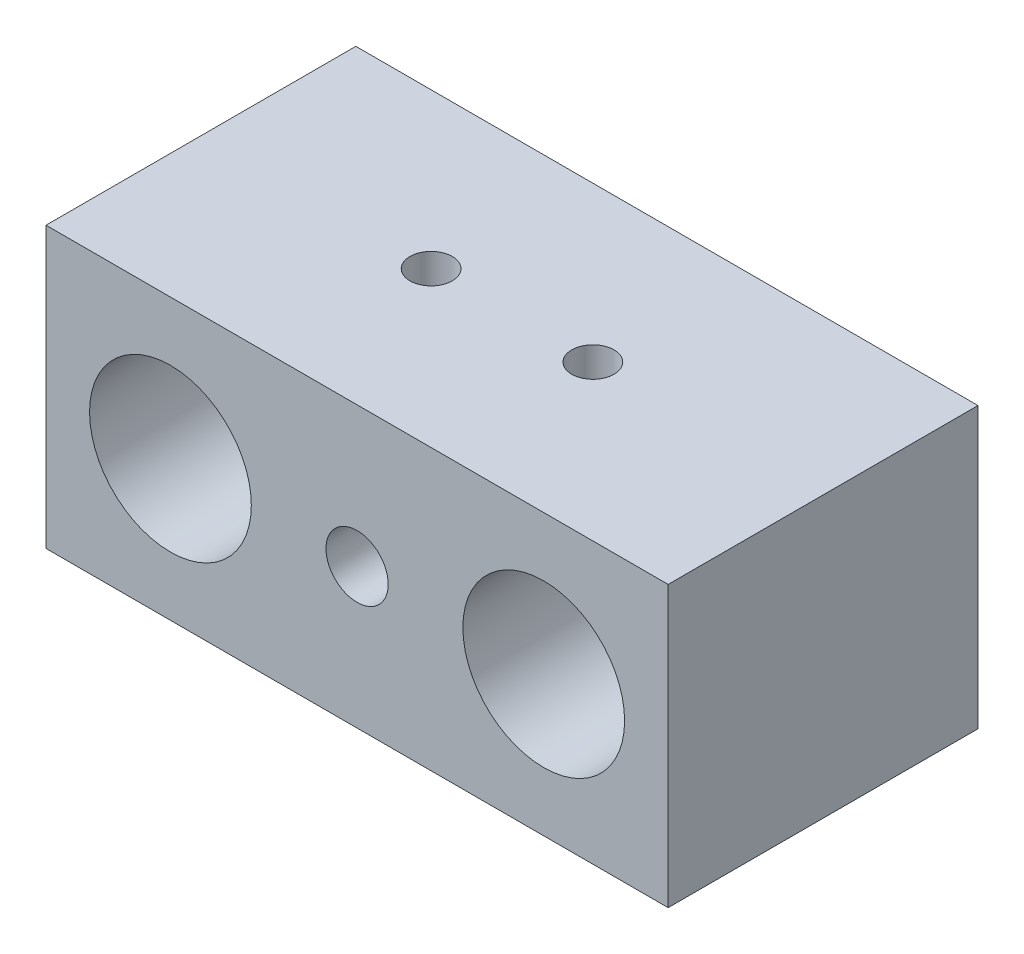
ISO-10303-21;
HEADER;
FILE_DESCRIPTION(('STEP AP214'),'2;1');
FILE_NAME('part.step','',(''),(''),'','','');
FILE_SCHEMA(('AUTOMOTIVE_DESIGN { 1 0 10303 214 1 1 1 1 }'));
ENDSEC;
DATA;
#1=APPLICATION_CONTEXT('core data for automotive mechanical design processes');
#2=APPLICATION_PROTOCOL_DEFINITION('international standard','automotive_design',2000,#1);
#3=PRODUCT_CONTEXT('',#1,'mechanical');
#4=PRODUCT('Part','Part','',(#3));
#5=PRODUCT_RELATED_PRODUCT_CATEGORY('part','',(#4));
#6=PRODUCT_DEFINITION_FORMATION('','',#4);
#7=PRODUCT_DEFINITION_CONTEXT('part definition',#1,'design');
#8=PRODUCT_DEFINITION('design','',#6,#7);
#9=PRODUCT_DEFINITION_SHAPE('','',#8);
#10=(LENGTH_UNIT() NAMED_UNIT(*) SI_UNIT(.MILLI.,.METRE.));
#11=(NAMED_UNIT(*) PLANE_ANGLE_UNIT() SI_UNIT($,.RADIAN.));
#12=(NAMED_UNIT(*) SI_UNIT($,.STERADIAN.) SOLID_ANGLE_UNIT());
#13=UNCERTAINTY_MEASURE_WITH_UNIT(LENGTH_MEASURE(1.E-05),#10,'distance_accuracy_value','');
#14=(GEOMETRIC_REPRESENTATION_CONTEXT(3) GLOBAL_UNCERTAINTY_ASSIGNED_CONTEXT((#13)) GLOBAL_UNIT_ASSIGNED_CONTEXT((#10,
#11,#12)) REPRESENTATION_CONTEXT('',''));
#15=CARTESIAN_POINT('',(0.,0.,0.));
#16=DIRECTION('',(0.,0.,1.));
#17=DIRECTION('',(1.,0.,0.));
#18=AXIS2_PLACEMENT_3D('',#15,#16,#17);
#19=CARTESIAN_POINT('',(0.,0.,-24.9));
#20=DIRECTION('',(0.,0.,1.));
#21=DIRECTION('',(1.,0.,0.));
#22=AXIS2_PLACEMENT_3D('',#19,#20,#21);
#23=CYLINDRICAL_SURFACE('',#22,5.);
#24=CARTESIAN_POINT('',(0.,0.,24.9));
#25=DIRECTION('',(0.,0.,1.));
#26=DIRECTION('',(1.,0.,0.));
#27=AXIS2_PLACEMENT_3D('',#24,#25,#26);
#28=CIRCLE('',#27,5.);
#29=CARTESIAN_POINT('',(5.,0.,24.9));
#30=VERTEX_POINT('',#29);
#31=EDGE_CURVE('P0_E20',#30,#30,#28,.F.);
#32=ORIENTED_EDGE('',*,*,#31,.F.);
#33=EDGE_LOOP('',(#32));
#34=FACE_BOUND('',#33,.T.);
#35=CARTESIAN_POINT('',(0.,0.,-24.9));
#36=DIRECTION('',(0.,0.,1.));
#37=DIRECTION('',(1.,0.,0.));
#38=AXIS2_PLACEMENT_3D('',#35,#36,#37);
#39=CIRCLE('',#38,5.);
#40=CARTESIAN_POINT('',(5.,0.,-24.9));
#41=VERTEX_POINT('',#40);
#42=EDGE_CURVE('P0_E101',#41,#41,#39,.F.);
#43=ORIENTED_EDGE('',*,*,#42,.T.);
#44=EDGE_LOOP('',(#43));
#45=FACE_BOUND('',#44,.T.);
#46=ADVANCED_FACE('P0_F17',(#34,#45),#23,.F.);
#47=CARTESIAN_POINT('',(-30.,0.,-24.9));
#48=DIRECTION('',(0.,0.,1.));
#49=DIRECTION('',(1.,0.,0.));
#50=AXIS2_PLACEMENT_3D('',#47,#48,#49);
#51=CYLINDRICAL_SURFACE('',#50,13.);
#52=CARTESIAN_POINT('',(-30.,0.,24.9));
#53=DIRECTION('',(0.,0.,1.));
#54=DIRECTION('',(1.,0.,0.));
#55=AXIS2_PLACEMENT_3D('',#52,#53,#54);
#56=CIRCLE('',#55,13.);
#57=CARTESIAN_POINT('',(-17.,0.,24.9));
#58=VERTEX_POINT('',#57);
#59=EDGE_CURVE('P0_E80',#58,#58,#56,.F.);
#60=ORIENTED_EDGE('',*,*,#59,.F.);
#61=EDGE_LOOP('',(#60));
#62=FACE_BOUND('',#61,.T.);
#63=CARTESIAN_POINT('',(-30.,0.,-24.9));
#64=DIRECTION('',(0.,0.,1.));
#65=DIRECTION('',(1.,0.,0.));
#66=AXIS2_PLACEMENT_3D('',#63,#64,#65);
#67=CIRCLE('',#66,13.);
#68=CARTESIAN_POINT('',(-17.,0.,-24.9));
#69=VERTEX_POINT('',#68);
#70=EDGE_CURVE('P0_E98',#69,#69,#67,.F.);
#71=ORIENTED_EDGE('',*,*,#70,.T.);
#72=EDGE_LOOP('',(#71));
#73=FACE_BOUND('',#72,.T.);
#74=ADVANCED_FACE('P0_F111',(#62,#73),#51,.F.);
#75=CARTESIAN_POINT('',(30.,0.,-24.9));
#76=DIRECTION('',(0.,0.,1.));
#77=DIRECTION('',(1.,0.,0.));
#78=AXIS2_PLACEMENT_3D('',#75,#76,#77);
#79=CYLINDRICAL_SURFACE('',#78,13.);
#80=CARTESIAN_POINT('',(30.,0.,24.9));
#81=DIRECTION('',(0.,0.,1.));
#82=DIRECTION('',(1.,0.,0.));
#83=AXIS2_PLACEMENT_3D('',#80,#81,#82);
#84=CIRCLE('',#83,13.);
#85=CARTESIAN_POINT('',(43.,0.,24.9));
#86=VERTEX_POINT('',#85);
#87=EDGE_CURVE('P0_E104',#86,#86,#84,.F.);
#88=ORIENTED_EDGE('',*,*,#87,.F.);
#89=EDGE_LOOP('',(#88));
#90=FACE_BOUND('',#89,.T.);
#91=CARTESIAN_POINT('',(30.,0.,-24.9));
#92=DIRECTION('',(0.,0.,1.));
#93=DIRECTION('',(1.,0.,0.));
#94=AXIS2_PLACEMENT_3D('',#91,#92,#93);
#95=CIRCLE('',#94,13.);
#96=CARTESIAN_POINT('',(43.,0.,-24.9));
#97=VERTEX_POINT('',#96);
#98=EDGE_CURVE('P0_E95',#97,#97,#95,.F.);
#99=ORIENTED_EDGE('',*,*,#98,.T.);
#100=EDGE_LOOP('',(#99));
#101=FACE_BOUND('',#100,.T.);
#102=ADVANCED_FACE('P0_F114',(#90,#101),#79,.F.);
#103=CARTESIAN_POINT('',(-50.,-22.5,-24.9));
#104=DIRECTION('',(0.,-1.,0.));
#105=DIRECTION('',(0.,0.,-1.));
#106=AXIS2_PLACEMENT_3D('',#103,#104,#105);
#107=PLANE('',#106);
#108=CARTESIAN_POINT('',(-13.,-22.5,0.));
#109=DIRECTION('',(0.,-1.,0.));
#110=DIRECTION('',(0.,0.,-1.));
#111=AXIS2_PLACEMENT_3D('',#108,#109,#110);
#112=CIRCLE('',#111,3.4);
#113=CARTESIAN_POINT('',(-13.,-22.5,-3.4));
#114=VERTEX_POINT('',#113);
#115=EDGE_CURVE('P0_E88',#114,#114,#112,.F.);
#116=ORIENTED_EDGE('',*,*,#115,.T.);
#117=EDGE_LOOP('',(#116));
#118=FACE_BOUND('',#117,.T.);
#119=CARTESIAN_POINT('',(13.,-22.5,0.));
#120=DIRECTION('',(0.,1.,0.));
#121=DIRECTION('',(0.,0.,1.));
#122=AXIS2_PLACEMENT_3D('',#119,#120,#121);
#123=CIRCLE('',#122,3.4);
#124=CARTESIAN_POINT('',(13.,-22.5,3.4));
#125=VERTEX_POINT('',#124);
#126=EDGE_CURVE('P0_E92',#125,#125,#123,.T.);
#127=ORIENTED_EDGE('',*,*,#126,.T.);
#128=EDGE_LOOP('',(#127));
#129=FACE_BOUND('',#128,.T.);
#130=DIRECTION('',(0.,0.,1.));
#131=VECTOR('',#130,1.);
#132=CARTESIAN_POINT('',(-50.,-22.5,-24.9));
#133=LINE('',#132,#131);
#134=CARTESIAN_POINT('',(-50.,-22.5,-24.9));
#135=VERTEX_POINT('',#134);
#136=CARTESIAN_POINT('',(-50.,-22.5,24.9));
#137=VERTEX_POINT('',#136);
#138=EDGE_CURVE('P0_E61',#135,#137,#133,.T.);
#139=ORIENTED_EDGE('',*,*,#138,.F.);
#140=DIRECTION('',(1.,0.,0.));
#141=VECTOR('',#140,1.);
#142=CARTESIAN_POINT('',(0.,-22.5,-24.9));
#143=LINE('',#142,#141);
#144=CARTESIAN_POINT('',(50.,-22.5,-24.9));
#145=VERTEX_POINT('',#144);
#146=EDGE_CURVE('P0_E126',#135,#145,#143,.T.);
#147=ORIENTED_EDGE('',*,*,#146,.T.);
#148=DIRECTION('',(0.,0.,-1.));
#149=VECTOR('',#148,1.);
#150=CARTESIAN_POINT('',(50.,-22.5,-24.9));
#151=LINE('',#150,#149);
#152=CARTESIAN_POINT('',(50.,-22.5,24.9));
#153=VERTEX_POINT('',#152);
#154=EDGE_CURVE('P0_E63',#153,#145,#151,.T.);
#155=ORIENTED_EDGE('',*,*,#154,.F.);
#156=DIRECTION('',(1.,0.,0.));
#157=VECTOR('',#156,1.);
#158=CARTESIAN_POINT('',(0.,-22.5,24.9));
#159=LINE('',#158,#157);
#160=EDGE_CURVE('P0_E56',#137,#153,#159,.T.);
#161=ORIENTED_EDGE('',*,*,#160,.F.);
#162=EDGE_LOOP('',(#139,#147,#155,#161));
#163=FACE_BOUND('',#162,.T.);
#164=ADVANCED_FACE('P0_F60',(#118,#129,#163),#107,.T.);
#165=CARTESIAN_POINT('',(-50.,22.5,-24.9));
#166=DIRECTION('',(-1.,0.,0.));
#167=DIRECTION('',(0.,0.,1.));
#168=AXIS2_PLACEMENT_3D('',#165,#166,#167);
#169=PLANE('',#168);
#170=DIRECTION('',(0.,0.,1.));
#171=VECTOR('',#170,1.);
#172=CARTESIAN_POINT('',(-50.,22.5,-24.9));
#173=LINE('',#172,#171);
#174=CARTESIAN_POINT('',(-50.,22.5,-24.9));
#175=VERTEX_POINT('',#174);
#176=CARTESIAN_POINT('',(-50.,22.5,24.9));
#177=VERTEX_POINT('',#176);
#178=EDGE_CURVE('P0_E91',#175,#177,#173,.T.);
#179=ORIENTED_EDGE('',*,*,#178,.F.);
#180=DIRECTION('',(0.,1.,0.));
#181=VECTOR('',#180,1.);
#182=CARTESIAN_POINT('',(-50.,0.,-24.9));
#183=LINE('',#182,#181);
#184=EDGE_CURVE('P0_E71',#175,#135,#183,.F.);
#185=ORIENTED_EDGE('',*,*,#184,.T.);
#186=ORIENTED_EDGE('',*,*,#138,.T.);
#187=DIRECTION('',(0.,1.,0.));
#188=VECTOR('',#187,1.);
#189=CARTESIAN_POINT('',(-50.,0.,24.9));
#190=LINE('',#189,#188);
#191=EDGE_CURVE('P0_E65',#177,#137,#190,.F.);
#192=ORIENTED_EDGE('',*,*,#191,.F.);
#193=EDGE_LOOP('',(#179,#185,#186,#192));
#194=FACE_BOUND('',#193,.T.);
#195=ADVANCED_FACE('P0_F68',(#194),#169,.T.);
#196=CARTESIAN_POINT('',(0.,0.,24.9));
#197=DIRECTION('',(0.,0.,1.));
#198=DIRECTION('',(1.,0.,0.));
#199=AXIS2_PLACEMENT_3D('',#196,#197,#198);
#200=PLANE('',#199);
#201=ORIENTED_EDGE('',*,*,#87,.T.);
#202=EDGE_LOOP('',(#201));
#203=FACE_BOUND('',#202,.T.);
#204=ORIENTED_EDGE('',*,*,#59,.T.);
#205=EDGE_LOOP('',(#204));
#206=FACE_BOUND('',#205,.T.);
#207=ORIENTED_EDGE('',*,*,#31,.T.);
#208=EDGE_LOOP('',(#207));
#209=FACE_BOUND('',#208,.T.);
#210=DIRECTION('',(1.,0.,0.));
#211=VECTOR('',#210,1.);
#212=CARTESIAN_POINT('',(50.,22.5,24.9));
#213=LINE('',#212,#211);
#214=CARTESIAN_POINT('',(50.,22.5,24.9));
#215=VERTEX_POINT('',#214);
#216=EDGE_CURVE('P0_E76',#177,#215,#213,.T.);
#217=ORIENTED_EDGE('',*,*,#216,.F.);
#218=ORIENTED_EDGE('',*,*,#191,.T.);
#219=ORIENTED_EDGE('',*,*,#160,.T.);
#220=DIRECTION('',(0.,1.,0.));
#221=VECTOR('',#220,1.);
#222=CARTESIAN_POINT('',(50.,-22.5,24.9));
#223=LINE('',#222,#221);
#224=EDGE_CURVE('P0_E82',#215,#153,#223,.F.);
#225=ORIENTED_EDGE('',*,*,#224,.F.);
#226=EDGE_LOOP('',(#217,#218,#219,#225));
#227=FACE_BOUND('',#226,.T.);
#228=ADVANCED_FACE('P0_F74',(#203,#206,#209,#227),#200,.T.);
#229=CARTESIAN_POINT('',(50.,-22.5,-24.9));
#230=DIRECTION('',(1.,0.,0.));
#231=DIRECTION('',(0.,0.,-1.));
#232=AXIS2_PLACEMENT_3D('',#229,#230,#231);
#233=PLANE('',#232);
#234=ORIENTED_EDGE('',*,*,#154,.T.);
#235=DIRECTION('',(0.,1.,0.));
#236=VECTOR('',#235,1.);
#237=CARTESIAN_POINT('',(50.,0.,-24.9));
#238=LINE('',#237,#236);
#239=CARTESIAN_POINT('',(50.,22.5,-24.9));
#240=VERTEX_POINT('',#239);
#241=EDGE_CURVE('P0_E35',#145,#240,#238,.T.);
#242=ORIENTED_EDGE('',*,*,#241,.T.);
#243=DIRECTION('',(0.,0.,1.));
#244=VECTOR('',#243,1.);
#245=CARTESIAN_POINT('',(50.,22.5,-24.9));
#246=LINE('',#245,#244);
#247=EDGE_CURVE('P0_E134',#215,#240,#246,.F.);
#248=ORIENTED_EDGE('',*,*,#247,.F.);
#249=ORIENTED_EDGE('',*,*,#224,.T.);
#250=EDGE_LOOP('',(#234,#242,#248,#249));
#251=FACE_BOUND('',#250,.T.);
#252=ADVANCED_FACE('P0_F121',(#251),#233,.T.);
#253=CARTESIAN_POINT('',(0.,0.,-24.9));
#254=DIRECTION('',(0.,0.,1.));
#255=DIRECTION('',(1.,0.,0.));
#256=AXIS2_PLACEMENT_3D('',#253,#254,#255);
#257=PLANE('',#256);
#258=ORIENTED_EDGE('',*,*,#98,.F.);
#259=EDGE_LOOP('',(#258));
#260=FACE_BOUND('',#259,.T.);
#261=ORIENTED_EDGE('',*,*,#70,.F.);
#262=EDGE_LOOP('',(#261));
#263=FACE_BOUND('',#262,.T.);
#264=ORIENTED_EDGE('',*,*,#42,.F.);
#265=EDGE_LOOP('',(#264));
#266=FACE_BOUND('',#265,.T.);
#267=ORIENTED_EDGE('',*,*,#241,.F.);
#268=ORIENTED_EDGE('',*,*,#146,.F.);
#269=ORIENTED_EDGE('',*,*,#184,.F.);
#270=DIRECTION('',(1.,0.,0.));
#271=VECTOR('',#270,1.);
#272=CARTESIAN_POINT('',(50.,22.5,-24.9));
#273=LINE('',#272,#271);
#274=EDGE_CURVE('P0_E87',#240,#175,#273,.F.);
#275=ORIENTED_EDGE('',*,*,#274,.F.);
#276=EDGE_LOOP('',(#267,#268,#269,#275));
#277=FACE_BOUND('',#276,.T.);
#278=ADVANCED_FACE('P0_F117',(#260,#263,#266,#277),#257,.F.);
#279=CARTESIAN_POINT('',(13.,-29.475,0.));
#280=DIRECTION('',(0.,1.,0.));
#281=DIRECTION('',(0.,0.,1.));
#282=AXIS2_PLACEMENT_3D('',#279,#280,#281);
#283=CYLINDRICAL_SURFACE('',#282,3.4);
#284=CARTESIAN_POINT('',(13.,22.5,0.));
#285=DIRECTION('',(0.,1.,0.));
#286=DIRECTION('',(0.,0.,1.));
#287=AXIS2_PLACEMENT_3D('',#284,#285,#286);
#288=CIRCLE('',#287,3.4);
#289=CARTESIAN_POINT('',(13.,22.5,3.4));
#290=VERTEX_POINT('',#289);
#291=EDGE_CURVE('P0_E26',#290,#290,#288,.F.);
#292=ORIENTED_EDGE('',*,*,#291,.F.);
#293=EDGE_LOOP('',(#292));
#294=FACE_BOUND('',#293,.T.);
#295=ORIENTED_EDGE('',*,*,#126,.F.);
#296=EDGE_LOOP('',(#295));
#297=FACE_BOUND('',#296,.T.);
#298=ADVANCED_FACE('P0_F120',(#294,#297),#283,.F.);
#299=CARTESIAN_POINT('',(-13.,-29.475,0.));
#300=DIRECTION('',(0.,-1.,0.));
#301=DIRECTION('',(0.,0.,-1.));
#302=AXIS2_PLACEMENT_3D('',#299,#300,#301);
#303=CYLINDRICAL_SURFACE('',#302,3.4);
#304=CARTESIAN_POINT('',(-13.,22.5,0.));
#305=DIRECTION('',(0.,-1.,0.));
#306=DIRECTION('',(0.,0.,-1.));
#307=AXIS2_PLACEMENT_3D('',#304,#305,#306);
#308=CIRCLE('',#307,3.4);
#309=CARTESIAN_POINT('',(-13.,22.5,-3.4));
#310=VERTEX_POINT('',#309);
#311=EDGE_CURVE('P0_E11',#310,#310,#308,.T.);
#312=ORIENTED_EDGE('',*,*,#311,.F.);
#313=EDGE_LOOP('',(#312));
#314=FACE_BOUND('',#313,.T.);
#315=ORIENTED_EDGE('',*,*,#115,.F.);
#316=EDGE_LOOP('',(#315));
#317=FACE_BOUND('',#316,.T.);
#318=ADVANCED_FACE('P0_F140',(#314,#317),#303,.F.);
#319=CARTESIAN_POINT('',(50.,22.5,-24.9));
#320=DIRECTION('',(0.,1.,0.));
#321=DIRECTION('',(0.,0.,1.));
#322=AXIS2_PLACEMENT_3D('',#319,#320,#321);
#323=PLANE('',#322);
#324=ORIENTED_EDGE('',*,*,#311,.T.);
#325=EDGE_LOOP('',(#324));
#326=FACE_BOUND('',#325,.T.);
#327=ORIENTED_EDGE('',*,*,#291,.T.);
#328=EDGE_LOOP('',(#327));
#329=FACE_BOUND('',#328,.T.);
#330=ORIENTED_EDGE('',*,*,#247,.T.);
#331=ORIENTED_EDGE('',*,*,#274,.T.);
#332=ORIENTED_EDGE('',*,*,#178,.T.);
#333=ORIENTED_EDGE('',*,*,#216,.T.);
#334=EDGE_LOOP('',(#330,#331,#332,#333));
#335=FACE_BOUND('',#334,.T.);
#336=ADVANCED_FACE('P0_F137',(#326,#329,#335),#323,.T.);
#337=CLOSED_SHELL('',(#46,#74,#102,#164,#195,#228,#252,#278,#298,#318,#336));
#338=MANIFOLD_SOLID_BREP('P0_B1',#337);
#339=CARTESIAN_POINT('',(-13.,-29.475,0.));
#340=DIRECTION('',(0.,-1.,0.));
#341=DIRECTION('',(0.,0.,-1.));
#342=AXIS2_PLACEMENT_3D('',#339,#340,#341);
#343=CYLINDRICAL_SURFACE('',#342,4.);
#344=CARTESIAN_POINT('',(-13.,22.5,0.));
#345=DIRECTION('',(0.,-1.,0.));
#346=DIRECTION('',(0.,0.,-1.));
#347=AXIS2_PLACEMENT_3D('',#344,#345,#346);
#348=CIRCLE('',#347,4.);
#349=CARTESIAN_POINT('',(-13.,22.5,-4.));
#350=VERTEX_POINT('',#349);
#351=EDGE_CURVE('P1_E16',#350,#350,#348,.T.);
#352=ORIENTED_EDGE('',*,*,#351,.T.);
#353=EDGE_LOOP('',(#352));
#354=FACE_BOUND('',#353,.T.);
#355=CARTESIAN_POINT('',(-13.,-22.5,0.));
#356=DIRECTION('',(0.,-1.,0.));
#357=DIRECTION('',(0.,0.,-1.));
#358=AXIS2_PLACEMENT_3D('',#355,#356,#357);
#359=CIRCLE('',#358,4.);
#360=CARTESIAN_POINT('',(-13.,-22.5,-4.));
#361=VERTEX_POINT('',#360);
#362=EDGE_CURVE('P1_E10',#361,#361,#359,.F.);
#363=ORIENTED_EDGE('',*,*,#362,.T.);
#364=EDGE_LOOP('',(#363));
#365=FACE_BOUND('',#364,.T.);
#366=ADVANCED_FACE('P1_F15',(#354,#365),#343,.T.);
#367=OPEN_SHELL('',(#366));
#368=SHELL_BASED_SURFACE_MODEL('P1_B1',(#367));
#369=CARTESIAN_POINT('',(13.,-29.475,0.));
#370=DIRECTION('',(0.,1.,0.));
#371=DIRECTION('',(0.,0.,1.));
#372=AXIS2_PLACEMENT_3D('',#369,#370,#371);
#373=CYLINDRICAL_SURFACE('',#372,4.);
#374=CARTESIAN_POINT('',(13.,22.5,0.));
#375=DIRECTION('',(0.,1.,0.));
#376=DIRECTION('',(0.,0.,1.));
#377=AXIS2_PLACEMENT_3D('',#374,#375,#376);
#378=CIRCLE('',#377,4.);
#379=CARTESIAN_POINT('',(13.,22.5,4.));
#380=VERTEX_POINT('',#379);
#381=EDGE_CURVE('P2_E10',#380,#380,#378,.F.);
#382=ORIENTED_EDGE('',*,*,#381,.T.);
#383=EDGE_LOOP('',(#382));
#384=FACE_BOUND('',#383,.T.);
#385=CARTESIAN_POINT('',(13.,-22.5,0.));
#386=DIRECTION('',(0.,1.,0.));
#387=DIRECTION('',(0.,0.,1.));
#388=AXIS2_PLACEMENT_3D('',#385,#386,#387);
#389=CIRCLE('',#388,4.);
#390=CARTESIAN_POINT('',(13.,-22.5,4.));
#391=VERTEX_POINT('',#390);
#392=EDGE_CURVE('P2_E16',#391,#391,#389,.T.);
#393=ORIENTED_EDGE('',*,*,#392,.T.);
#394=EDGE_LOOP('',(#393));
#395=FACE_BOUND('',#394,.T.);
#396=ADVANCED_FACE('P2_F15',(#384,#395),#373,.T.);
#397=OPEN_SHELL('',(#396));
#398=SHELL_BASED_SURFACE_MODEL('P2_B1',(#397));
#399=ADVANCED_BREP_SHAPE_REPRESENTATION('',(#18,#338),#14);
#400=MANIFOLD_SURFACE_SHAPE_REPRESENTATION('',(#18,#368,#398),#14);
#401=SHAPE_REPRESENTATION('',(#18),#14);
#402=SHAPE_DEFINITION_REPRESENTATION(#9,#401);
#403=SHAPE_REPRESENTATION_RELATIONSHIP('','',#401,#399);
#404=SHAPE_REPRESENTATION_RELATIONSHIP('','',#401,#400);
ENDSEC;
END-ISO-10303-21;
